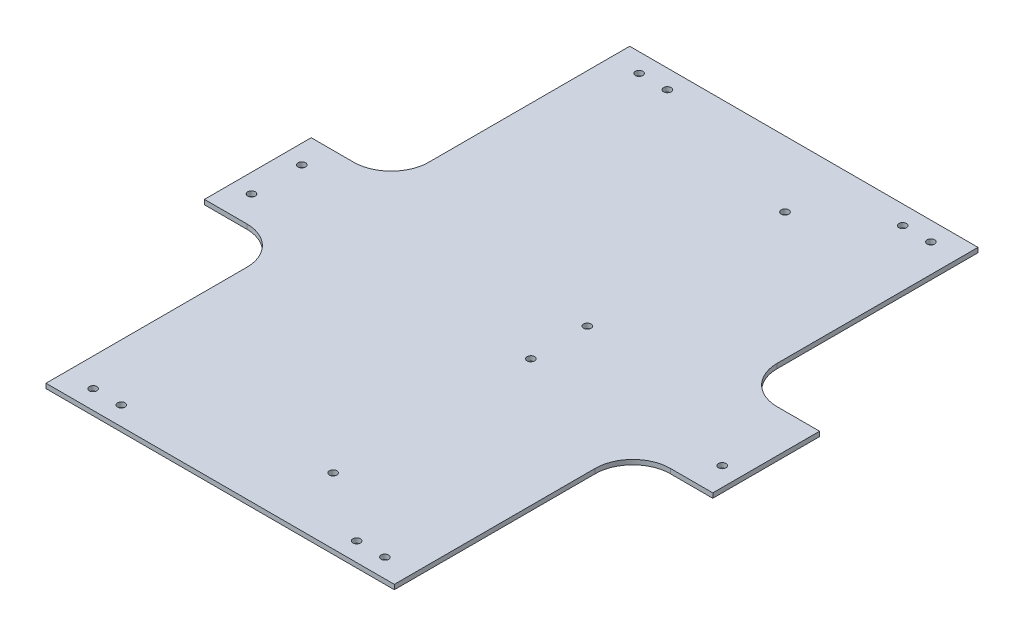
ISO-10303-21;
HEADER;
FILE_DESCRIPTION(('STEP AP214'),'2;1');
FILE_NAME('part.step','',(''),(''),'','','');
FILE_SCHEMA(('AUTOMOTIVE_DESIGN { 1 0 10303 214 1 1 1 1 }'));
ENDSEC;
DATA;
#1=APPLICATION_CONTEXT('core data for automotive mechanical design processes');
#2=APPLICATION_PROTOCOL_DEFINITION('international standard','automotive_design',2000,#1);
#3=PRODUCT_CONTEXT('',#1,'mechanical');
#4=PRODUCT('Part','Part','',(#3));
#5=PRODUCT_RELATED_PRODUCT_CATEGORY('part','',(#4));
#6=PRODUCT_DEFINITION_FORMATION('','',#4);
#7=PRODUCT_DEFINITION_CONTEXT('part definition',#1,'design');
#8=PRODUCT_DEFINITION('design','',#6,#7);
#9=PRODUCT_DEFINITION_SHAPE('','',#8);
#10=(LENGTH_UNIT() NAMED_UNIT(*) SI_UNIT(.MILLI.,.METRE.));
#11=(NAMED_UNIT(*) PLANE_ANGLE_UNIT() SI_UNIT($,.RADIAN.));
#12=(NAMED_UNIT(*) SI_UNIT($,.STERADIAN.) SOLID_ANGLE_UNIT());
#13=UNCERTAINTY_MEASURE_WITH_UNIT(LENGTH_MEASURE(1.E-05),#10,'distance_accuracy_value','');
#14=(GEOMETRIC_REPRESENTATION_CONTEXT(3) GLOBAL_UNCERTAINTY_ASSIGNED_CONTEXT((#13)) GLOBAL_UNIT_ASSIGNED_CONTEXT((#10,
#11,#12)) REPRESENTATION_CONTEXT('',''));
#15=CARTESIAN_POINT('',(0.,0.,0.));
#16=DIRECTION('',(0.,0.,1.));
#17=DIRECTION('',(1.,0.,0.));
#18=AXIS2_PLACEMENT_3D('',#15,#16,#17);
#19=CARTESIAN_POINT('',(0.,-107.700994014148,0.));
#20=DIRECTION('',(0.,-1.,0.));
#21=DIRECTION('',(0.,0.,-1.));
#22=AXIS2_PLACEMENT_3D('',#19,#20,#21);
#23=PLANE('',#22);
#24=DIRECTION('',(-1.,0.,0.));
#25=VECTOR('',#24,1.);
#26=CARTESIAN_POINT('',(271.436244825124,-107.700994014148,-21.4532223759465));
#27=LINE('',#26,#25);
#28=CARTESIAN_POINT('',(271.436244825124,-107.700994014148,-21.4532223759465));
#29=VERTEX_POINT('',#28);
#30=CARTESIAN_POINT('',(226.436244825124,-107.700994014148,-21.4532223759465));
#31=VERTEX_POINT('',#30);
#32=EDGE_CURVE('E252',#29,#31,#27,.T.);
#33=ORIENTED_EDGE('',*,*,#32,.T.);
#34=CARTESIAN_POINT('',(226.436244825124,-107.700994014148,-61.4532223759465));
#35=DIRECTION('',(0.,-1.,0.));
#36=DIRECTION('',(0.,0.,-1.));
#37=AXIS2_PLACEMENT_3D('',#34,#35,#36);
#38=CIRCLE('',#37,40.);
#39=CARTESIAN_POINT('',(186.436244825124,-107.700994014148,-61.4532223759465));
#40=VERTEX_POINT('',#39);
#41=EDGE_CURVE('E153',#31,#40,#38,.T.);
#42=ORIENTED_EDGE('',*,*,#41,.T.);
#43=DIRECTION('',(0.,0.,-1.));
#44=VECTOR('',#43,1.);
#45=CARTESIAN_POINT('',(186.436244825124,-107.700994014148,-274.737493623405));
#46=LINE('',#45,#44);
#47=CARTESIAN_POINT('',(186.436244825124,-107.700994014148,-274.737493623405));
#48=VERTEX_POINT('',#47);
#49=EDGE_CURVE('E145',#40,#48,#46,.T.);
#50=ORIENTED_EDGE('',*,*,#49,.T.);
#51=DIRECTION('',(-1.,0.,0.));
#52=VECTOR('',#51,1.);
#53=CARTESIAN_POINT('',(186.436244825124,-107.700994014148,-274.737493623405));
#54=LINE('',#53,#52);
#55=CARTESIAN_POINT('',(-183.563755174876,-107.700994014148,-274.737493623405));
#56=VERTEX_POINT('',#55);
#57=EDGE_CURVE('E150',#48,#56,#54,.T.);
#58=ORIENTED_EDGE('',*,*,#57,.T.);
#59=DIRECTION('',(0.,0.,1.));
#60=VECTOR('',#59,1.);
#61=CARTESIAN_POINT('',(-183.563755174876,-107.700994014148,-274.737493623405));
#62=LINE('',#61,#60);
#63=CARTESIAN_POINT('',(-183.563755174876,-107.700994014148,-61.4532223759464));
#64=VERTEX_POINT('',#63);
#65=EDGE_CURVE('E167',#56,#64,#62,.T.);
#66=ORIENTED_EDGE('',*,*,#65,.T.);
#67=CARTESIAN_POINT('',(-223.563755174876,-107.700994014148,-61.4532223759464));
#68=DIRECTION('',(0.,-1.,0.));
#69=DIRECTION('',(0.,0.,-1.));
#70=AXIS2_PLACEMENT_3D('',#67,#68,#69);
#71=CIRCLE('',#70,40.);
#72=CARTESIAN_POINT('',(-223.563755174876,-107.700994014148,-21.4532223759464));
#73=VERTEX_POINT('',#72);
#74=EDGE_CURVE('E198',#64,#73,#71,.T.);
#75=ORIENTED_EDGE('',*,*,#74,.T.);
#76=DIRECTION('',(-1.,0.,0.));
#77=VECTOR('',#76,1.);
#78=CARTESIAN_POINT('',(-183.563755174876,-107.700994014148,-21.4532223759464));
#79=LINE('',#78,#77);
#80=CARTESIAN_POINT('',(-268.563755174877,-107.700994014148,-21.4532223759464));
#81=VERTEX_POINT('',#80);
#82=EDGE_CURVE('E309',#73,#81,#79,.T.);
#83=ORIENTED_EDGE('',*,*,#82,.T.);
#84=DIRECTION('',(0.,0.,1.));
#85=VECTOR('',#84,1.);
#86=CARTESIAN_POINT('',(-268.563755174877,-107.700994014148,-21.4532223759464));
#87=LINE('',#86,#85);
#88=CARTESIAN_POINT('',(-268.563755174877,-107.700994014148,91.978235129135));
#89=VERTEX_POINT('',#88);
#90=EDGE_CURVE('E268',#81,#89,#87,.T.);
#91=ORIENTED_EDGE('',*,*,#90,.T.);
#92=DIRECTION('',(1.,0.,0.));
#93=VECTOR('',#92,1.);
#94=CARTESIAN_POINT('',(-183.563755174876,-107.700994014148,91.978235129135));
#95=LINE('',#94,#93);
#96=CARTESIAN_POINT('',(-223.563755174876,-107.700994014148,91.978235129135));
#97=VERTEX_POINT('',#96);
#98=EDGE_CURVE('E291',#89,#97,#95,.T.);
#99=ORIENTED_EDGE('',*,*,#98,.T.);
#100=CARTESIAN_POINT('',(-223.563755174876,-107.700994014148,131.978235129135));
#101=DIRECTION('',(0.,-1.,0.));
#102=DIRECTION('',(0.,0.,-1.));
#103=AXIS2_PLACEMENT_3D('',#100,#101,#102);
#104=CIRCLE('',#103,40.);
#105=CARTESIAN_POINT('',(-183.563755174876,-107.700994014148,131.978235129135));
#106=VERTEX_POINT('',#105);
#107=EDGE_CURVE('E11',#97,#106,#104,.T.);
#108=ORIENTED_EDGE('',*,*,#107,.T.);
#109=DIRECTION('',(0.,0.,1.));
#110=VECTOR('',#109,1.);
#111=CARTESIAN_POINT('',(-183.563755174876,-107.700994014148,91.978235129135));
#112=LINE('',#111,#110);
#113=CARTESIAN_POINT('',(-183.563755174876,-107.700994014148,345.262506376595));
#114=VERTEX_POINT('',#113);
#115=EDGE_CURVE('E288',#106,#114,#112,.T.);
#116=ORIENTED_EDGE('',*,*,#115,.T.);
#117=DIRECTION('',(1.,0.,0.));
#118=VECTOR('',#117,1.);
#119=CARTESIAN_POINT('',(186.436244825124,-107.700994014148,345.262506376595));
#120=LINE('',#119,#118);
#121=CARTESIAN_POINT('',(186.436244825124,-107.700994014148,345.262506376595));
#122=VERTEX_POINT('',#121);
#123=EDGE_CURVE('E287',#114,#122,#120,.T.);
#124=ORIENTED_EDGE('',*,*,#123,.T.);
#125=DIRECTION('',(0.,0.,-1.));
#126=VECTOR('',#125,1.);
#127=CARTESIAN_POINT('',(186.436244825124,-107.700994014148,91.978235129135));
#128=LINE('',#127,#126);
#129=CARTESIAN_POINT('',(186.436244825124,-107.700994014148,131.978235129135));
#130=VERTEX_POINT('',#129);
#131=EDGE_CURVE('E212',#122,#130,#128,.T.);
#132=ORIENTED_EDGE('',*,*,#131,.T.);
#133=CARTESIAN_POINT('',(226.436244825124,-107.700994014148,131.978235129135));
#134=DIRECTION('',(0.,-1.,0.));
#135=DIRECTION('',(0.,0.,-1.));
#136=AXIS2_PLACEMENT_3D('',#133,#134,#135);
#137=CIRCLE('',#136,40.);
#138=CARTESIAN_POINT('',(226.436244825124,-107.700994014148,91.978235129135));
#139=VERTEX_POINT('',#138);
#140=EDGE_CURVE('E205',#130,#139,#137,.T.);
#141=ORIENTED_EDGE('',*,*,#140,.T.);
#142=DIRECTION('',(1.,0.,0.));
#143=VECTOR('',#142,1.);
#144=CARTESIAN_POINT('',(271.436244825124,-107.700994014148,91.9782351291349));
#145=LINE('',#144,#143);
#146=CARTESIAN_POINT('',(271.436244825124,-107.700994014148,91.9782351291349));
#147=VERTEX_POINT('',#146);
#148=EDGE_CURVE('E209',#139,#147,#145,.T.);
#149=ORIENTED_EDGE('',*,*,#148,.T.);
#150=DIRECTION('',(0.,0.,-1.));
#151=VECTOR('',#150,1.);
#152=CARTESIAN_POINT('',(271.436244825124,-107.700994014148,-21.4532223759465));
#153=LINE('',#152,#151);
#154=EDGE_CURVE('E222',#147,#29,#153,.T.);
#155=ORIENTED_EDGE('',*,*,#154,.T.);
#156=EDGE_LOOP('',(#33,#42,#50,#58,#66,#75,#83,#91,#99,#108,#116,#124,#132,#141,#149,#155));
#157=FACE_BOUND('',#156,.T.);
#158=CARTESIAN_POINT('',(156.436244825124,-107.700994014148,325.262506376594));
#159=DIRECTION('',(0.,1.,0.));
#160=DIRECTION('',(0.,0.,1.));
#161=AXIS2_PLACEMENT_3D('',#158,#159,#160);
#162=CIRCLE('',#161,3.99999999999999);
#163=CARTESIAN_POINT('',(156.436244825124,-107.700994014148,329.262506376594));
#164=VERTEX_POINT('',#163);
#165=EDGE_CURVE('E299',#164,#164,#162,.T.);
#166=ORIENTED_EDGE('',*,*,#165,.F.);
#167=EDGE_LOOP('',(#166));
#168=FACE_BOUND('',#167,.T.);
#169=CARTESIAN_POINT('',(126.436244825124,-107.700994014148,325.262506376594));
#170=DIRECTION('',(0.,1.,0.));
#171=DIRECTION('',(0.,0.,1.));
#172=AXIS2_PLACEMENT_3D('',#169,#170,#171);
#173=CIRCLE('',#172,3.99999999999999);
#174=CARTESIAN_POINT('',(126.436244825124,-107.700994014148,329.262506376594));
#175=VERTEX_POINT('',#174);
#176=EDGE_CURVE('E626',#175,#175,#173,.T.);
#177=ORIENTED_EDGE('',*,*,#176,.F.);
#178=EDGE_LOOP('',(#177));
#179=FACE_BOUND('',#178,.T.);
#180=CARTESIAN_POINT('',(251.436244825124,-107.700994014148,61.9782351291349));
#181=DIRECTION('',(0.,1.,0.));
#182=DIRECTION('',(0.,0.,1.));
#183=AXIS2_PLACEMENT_3D('',#180,#181,#182);
#184=CIRCLE('',#183,3.99999999999999);
#185=CARTESIAN_POINT('',(251.436244825124,-107.700994014148,65.9782351291349));
#186=VERTEX_POINT('',#185);
#187=EDGE_CURVE('E634',#186,#186,#184,.T.);
#188=ORIENTED_EDGE('',*,*,#187,.F.);
#189=EDGE_LOOP('',(#188));
#190=FACE_BOUND('',#189,.T.);
#191=CARTESIAN_POINT('',(-153.563755174876,-107.700994014148,325.262506376594));
#192=DIRECTION('',(0.,1.,0.));
#193=DIRECTION('',(0.,0.,1.));
#194=AXIS2_PLACEMENT_3D('',#191,#192,#193);
#195=CIRCLE('',#194,3.99999999999999);
#196=CARTESIAN_POINT('',(-153.563755174876,-107.700994014148,329.262506376594));
#197=VERTEX_POINT('',#196);
#198=EDGE_CURVE('E639',#197,#197,#195,.T.);
#199=ORIENTED_EDGE('',*,*,#198,.F.);
#200=EDGE_LOOP('',(#199));
#201=FACE_BOUND('',#200,.T.);
#202=CARTESIAN_POINT('',(-123.563755174876,-107.700994014148,325.262506376595));
#203=DIRECTION('',(0.,1.,0.));
#204=DIRECTION('',(0.,0.,1.));
#205=AXIS2_PLACEMENT_3D('',#202,#203,#204);
#206=CIRCLE('',#205,4.00000000000001);
#207=CARTESIAN_POINT('',(-123.563755174876,-107.700994014148,329.262506376595));
#208=VERTEX_POINT('',#207);
#209=EDGE_CURVE('E645',#208,#208,#206,.T.);
#210=ORIENTED_EDGE('',*,*,#209,.F.);
#211=EDGE_LOOP('',(#210));
#212=FACE_BOUND('',#211,.T.);
#213=CARTESIAN_POINT('',(-248.563755174876,-107.700994014148,61.978235129135));
#214=DIRECTION('',(0.,1.,0.));
#215=DIRECTION('',(0.,0.,1.));
#216=AXIS2_PLACEMENT_3D('',#213,#214,#215);
#217=CIRCLE('',#216,3.99999999999999);
#218=CARTESIAN_POINT('',(-248.563755174876,-107.700994014148,65.978235129135));
#219=VERTEX_POINT('',#218);
#220=EDGE_CURVE('E651',#219,#219,#217,.T.);
#221=ORIENTED_EDGE('',*,*,#220,.F.);
#222=EDGE_LOOP('',(#221));
#223=FACE_BOUND('',#222,.T.);
#224=CARTESIAN_POINT('',(51.4362448251237,-107.700994014148,275.262506376595));
#225=DIRECTION('',(0.,1.,0.));
#226=DIRECTION('',(0.,0.,1.));
#227=AXIS2_PLACEMENT_3D('',#224,#225,#226);
#228=CIRCLE('',#227,4.00000000000001);
#229=CARTESIAN_POINT('',(51.4362448251237,-107.700994014148,279.262506376595));
#230=VERTEX_POINT('',#229);
#231=EDGE_CURVE('E657',#230,#230,#228,.T.);
#232=ORIENTED_EDGE('',*,*,#231,.F.);
#233=EDGE_LOOP('',(#232));
#234=FACE_BOUND('',#233,.T.);
#235=CARTESIAN_POINT('',(51.4362448251236,-107.700994014148,65.2625063765943));
#236=DIRECTION('',(0.,1.,0.));
#237=DIRECTION('',(0.,0.,1.));
#238=AXIS2_PLACEMENT_3D('',#235,#236,#237);
#239=CIRCLE('',#238,4.00000000000001);
#240=CARTESIAN_POINT('',(51.4362448251236,-107.700994014148,69.2625063765943));
#241=VERTEX_POINT('',#240);
#242=EDGE_CURVE('E663',#241,#241,#239,.T.);
#243=ORIENTED_EDGE('',*,*,#242,.F.);
#244=EDGE_LOOP('',(#243));
#245=FACE_BOUND('',#244,.T.);
#246=CARTESIAN_POINT('',(51.4362448251236,-107.700994014148,5.26250637659487));
#247=DIRECTION('',(0.,1.,0.));
#248=DIRECTION('',(0.,0.,-1.));
#249=AXIS2_PLACEMENT_3D('',#246,#247,#248);
#250=CIRCLE('',#249,4.00000000000001);
#251=CARTESIAN_POINT('',(51.4362448251236,-107.700994014148,1.26250637659487));
#252=VERTEX_POINT('',#251);
#253=EDGE_CURVE('E669',#252,#252,#250,.T.);
#254=ORIENTED_EDGE('',*,*,#253,.F.);
#255=EDGE_LOOP('',(#254));
#256=FACE_BOUND('',#255,.T.);
#257=CARTESIAN_POINT('',(51.4362448251237,-107.700994014148,-204.737493623405));
#258=DIRECTION('',(0.,1.,0.));
#259=DIRECTION('',(0.,0.,-1.));
#260=AXIS2_PLACEMENT_3D('',#257,#258,#259);
#261=CIRCLE('',#260,4.00000000000001);
#262=CARTESIAN_POINT('',(51.4362448251237,-107.700994014148,-208.737493623405));
#263=VERTEX_POINT('',#262);
#264=EDGE_CURVE('E675',#263,#263,#261,.T.);
#265=ORIENTED_EDGE('',*,*,#264,.F.);
#266=EDGE_LOOP('',(#265));
#267=FACE_BOUND('',#266,.T.);
#268=CARTESIAN_POINT('',(-248.563755174876,-107.700994014148,8.54677762405411));
#269=DIRECTION('',(0.,1.,0.));
#270=DIRECTION('',(0.,0.,-1.));
#271=AXIS2_PLACEMENT_3D('',#268,#269,#270);
#272=CIRCLE('',#271,3.99999999999999);
#273=CARTESIAN_POINT('',(-248.563755174876,-107.700994014148,4.54677762405412));
#274=VERTEX_POINT('',#273);
#275=EDGE_CURVE('E681',#274,#274,#272,.T.);
#276=ORIENTED_EDGE('',*,*,#275,.F.);
#277=EDGE_LOOP('',(#276));
#278=FACE_BOUND('',#277,.T.);
#279=CARTESIAN_POINT('',(-123.563755174876,-107.700994014148,-254.737493623405));
#280=DIRECTION('',(0.,1.,0.));
#281=DIRECTION('',(0.,0.,-1.));
#282=AXIS2_PLACEMENT_3D('',#279,#280,#281);
#283=CIRCLE('',#282,4.00000000000001);
#284=CARTESIAN_POINT('',(-123.563755174876,-107.700994014148,-258.737493623405));
#285=VERTEX_POINT('',#284);
#286=EDGE_CURVE('E687',#285,#285,#283,.T.);
#287=ORIENTED_EDGE('',*,*,#286,.F.);
#288=EDGE_LOOP('',(#287));
#289=FACE_BOUND('',#288,.T.);
#290=CARTESIAN_POINT('',(-153.563755174876,-107.700994014148,-254.737493623405));
#291=DIRECTION('',(0.,1.,0.));
#292=DIRECTION('',(0.,0.,-1.));
#293=AXIS2_PLACEMENT_3D('',#290,#291,#292);
#294=CIRCLE('',#293,3.99999999999999);
#295=CARTESIAN_POINT('',(-153.563755174876,-107.700994014148,-258.737493623405));
#296=VERTEX_POINT('',#295);
#297=EDGE_CURVE('E693',#296,#296,#294,.T.);
#298=ORIENTED_EDGE('',*,*,#297,.F.);
#299=EDGE_LOOP('',(#298));
#300=FACE_BOUND('',#299,.T.);
#301=CARTESIAN_POINT('',(126.436244825124,-107.700994014148,-254.737493623405));
#302=DIRECTION('',(0.,1.,0.));
#303=DIRECTION('',(0.,0.,-1.));
#304=AXIS2_PLACEMENT_3D('',#301,#302,#303);
#305=CIRCLE('',#304,3.99999999999999);
#306=CARTESIAN_POINT('',(126.436244825124,-107.700994014148,-258.737493623405));
#307=VERTEX_POINT('',#306);
#308=EDGE_CURVE('E699',#307,#307,#305,.T.);
#309=ORIENTED_EDGE('',*,*,#308,.F.);
#310=EDGE_LOOP('',(#309));
#311=FACE_BOUND('',#310,.T.);
#312=CARTESIAN_POINT('',(156.436244825124,-107.700994014148,-254.737493623405));
#313=DIRECTION('',(0.,1.,0.));
#314=DIRECTION('',(0.,0.,-1.));
#315=AXIS2_PLACEMENT_3D('',#312,#313,#314);
#316=CIRCLE('',#315,3.99999999999999);
#317=CARTESIAN_POINT('',(156.436244825124,-107.700994014148,-258.737493623405));
#318=VERTEX_POINT('',#317);
#319=EDGE_CURVE('E705',#318,#318,#316,.T.);
#320=ORIENTED_EDGE('',*,*,#319,.F.);
#321=EDGE_LOOP('',(#320));
#322=FACE_BOUND('',#321,.T.);
#323=ADVANCED_FACE('F33',(#157,#168,#179,#190,#201,#212,#223,#234,#245,#256,#267,#278,#289,#300,
#311,#322),#23,.F.);
#324=CARTESIAN_POINT('',(0.,-112.700994014148,0.));
#325=DIRECTION('',(0.,-1.,0.));
#326=DIRECTION('',(0.,0.,-1.));
#327=AXIS2_PLACEMENT_3D('',#324,#325,#326);
#328=PLANE('',#327);
#329=CARTESIAN_POINT('',(126.436244825124,-112.700994014148,-254.737493623405));
#330=DIRECTION('',(0.,1.,0.));
#331=DIRECTION('',(0.,0.,-1.));
#332=AXIS2_PLACEMENT_3D('',#329,#330,#331);
#333=CIRCLE('',#332,3.99999999999999);
#334=CARTESIAN_POINT('',(126.436244825124,-112.700994014148,-258.737493623405));
#335=VERTEX_POINT('',#334);
#336=EDGE_CURVE('E702',#335,#335,#333,.T.);
#337=ORIENTED_EDGE('',*,*,#336,.T.);
#338=EDGE_LOOP('',(#337));
#339=FACE_BOUND('',#338,.T.);
#340=CARTESIAN_POINT('',(-123.563755174876,-112.700994014148,-254.737493623405));
#341=DIRECTION('',(0.,1.,0.));
#342=DIRECTION('',(0.,0.,-1.));
#343=AXIS2_PLACEMENT_3D('',#340,#341,#342);
#344=CIRCLE('',#343,4.00000000000001);
#345=CARTESIAN_POINT('',(-123.563755174876,-112.700994014148,-258.737493623405));
#346=VERTEX_POINT('',#345);
#347=EDGE_CURVE('E690',#346,#346,#344,.T.);
#348=ORIENTED_EDGE('',*,*,#347,.T.);
#349=EDGE_LOOP('',(#348));
#350=FACE_BOUND('',#349,.T.);
#351=CARTESIAN_POINT('',(51.4362448251237,-112.700994014148,-204.737493623405));
#352=DIRECTION('',(0.,1.,0.));
#353=DIRECTION('',(0.,0.,-1.));
#354=AXIS2_PLACEMENT_3D('',#351,#352,#353);
#355=CIRCLE('',#354,4.00000000000001);
#356=CARTESIAN_POINT('',(51.4362448251237,-112.700994014148,-208.737493623405));
#357=VERTEX_POINT('',#356);
#358=EDGE_CURVE('E678',#357,#357,#355,.T.);
#359=ORIENTED_EDGE('',*,*,#358,.T.);
#360=EDGE_LOOP('',(#359));
#361=FACE_BOUND('',#360,.T.);
#362=CARTESIAN_POINT('',(51.4362448251236,-112.700994014148,65.2625063765943));
#363=DIRECTION('',(0.,1.,0.));
#364=DIRECTION('',(0.,0.,1.));
#365=AXIS2_PLACEMENT_3D('',#362,#363,#364);
#366=CIRCLE('',#365,4.00000000000001);
#367=CARTESIAN_POINT('',(51.4362448251236,-112.700994014148,69.2625063765943));
#368=VERTEX_POINT('',#367);
#369=EDGE_CURVE('E666',#368,#368,#366,.T.);
#370=ORIENTED_EDGE('',*,*,#369,.T.);
#371=EDGE_LOOP('',(#370));
#372=FACE_BOUND('',#371,.T.);
#373=CARTESIAN_POINT('',(-248.563755174876,-112.700994014148,61.978235129135));
#374=DIRECTION('',(0.,1.,0.));
#375=DIRECTION('',(0.,0.,1.));
#376=AXIS2_PLACEMENT_3D('',#373,#374,#375);
#377=CIRCLE('',#376,3.99999999999999);
#378=CARTESIAN_POINT('',(-248.563755174876,-112.700994014148,65.978235129135));
#379=VERTEX_POINT('',#378);
#380=EDGE_CURVE('E654',#379,#379,#377,.T.);
#381=ORIENTED_EDGE('',*,*,#380,.T.);
#382=EDGE_LOOP('',(#381));
#383=FACE_BOUND('',#382,.T.);
#384=CARTESIAN_POINT('',(-153.563755174876,-112.700994014148,325.262506376594));
#385=DIRECTION('',(0.,1.,0.));
#386=DIRECTION('',(0.,0.,1.));
#387=AXIS2_PLACEMENT_3D('',#384,#385,#386);
#388=CIRCLE('',#387,3.99999999999999);
#389=CARTESIAN_POINT('',(-153.563755174876,-112.700994014148,329.262506376594));
#390=VERTEX_POINT('',#389);
#391=EDGE_CURVE('E642',#390,#390,#388,.T.);
#392=ORIENTED_EDGE('',*,*,#391,.T.);
#393=EDGE_LOOP('',(#392));
#394=FACE_BOUND('',#393,.T.);
#395=CARTESIAN_POINT('',(126.436244825124,-112.700994014148,325.262506376594));
#396=DIRECTION('',(0.,1.,0.));
#397=DIRECTION('',(0.,0.,1.));
#398=AXIS2_PLACEMENT_3D('',#395,#396,#397);
#399=CIRCLE('',#398,3.99999999999999);
#400=CARTESIAN_POINT('',(126.436244825124,-112.700994014148,329.262506376594));
#401=VERTEX_POINT('',#400);
#402=EDGE_CURVE('E630',#401,#401,#399,.T.);
#403=ORIENTED_EDGE('',*,*,#402,.T.);
#404=EDGE_LOOP('',(#403));
#405=FACE_BOUND('',#404,.T.);
#406=DIRECTION('',(0.,0.,-1.));
#407=VECTOR('',#406,1.);
#408=CARTESIAN_POINT('',(186.436244825124,-112.700994014148,-274.737493623405));
#409=LINE('',#408,#407);
#410=CARTESIAN_POINT('',(186.436244825124,-112.700994014148,-61.4532223759465));
#411=VERTEX_POINT('',#410);
#412=CARTESIAN_POINT('',(186.436244825124,-112.700994014148,-274.737493623405));
#413=VERTEX_POINT('',#412);
#414=EDGE_CURVE('E171',#411,#413,#409,.T.);
#415=ORIENTED_EDGE('',*,*,#414,.F.);
#416=CARTESIAN_POINT('',(226.436244825124,-112.700994014148,-61.4532223759465));
#417=DIRECTION('',(0.,-1.,0.));
#418=DIRECTION('',(0.,0.,-1.));
#419=AXIS2_PLACEMENT_3D('',#416,#417,#418);
#420=CIRCLE('',#419,40.);
#421=CARTESIAN_POINT('',(226.436244825124,-112.700994014148,-21.4532223759465));
#422=VERTEX_POINT('',#421);
#423=EDGE_CURVE('E200',#411,#422,#420,.F.);
#424=ORIENTED_EDGE('',*,*,#423,.T.);
#425=DIRECTION('',(-1.,0.,0.));
#426=VECTOR('',#425,1.);
#427=CARTESIAN_POINT('',(271.436244825124,-112.700994014148,-21.4532223759465));
#428=LINE('',#427,#426);
#429=CARTESIAN_POINT('',(271.436244825124,-112.700994014148,-21.4532223759465));
#430=VERTEX_POINT('',#429);
#431=EDGE_CURVE('E158',#430,#422,#428,.T.);
#432=ORIENTED_EDGE('',*,*,#431,.F.);
#433=DIRECTION('',(0.,0.,-1.));
#434=VECTOR('',#433,1.);
#435=CARTESIAN_POINT('',(271.436244825124,-112.700994014148,-21.4532223759465));
#436=LINE('',#435,#434);
#437=CARTESIAN_POINT('',(271.436244825124,-112.700994014148,91.9782351291349));
#438=VERTEX_POINT('',#437);
#439=EDGE_CURVE('E240',#438,#430,#436,.T.);
#440=ORIENTED_EDGE('',*,*,#439,.F.);
#441=DIRECTION('',(1.,0.,0.));
#442=VECTOR('',#441,1.);
#443=CARTESIAN_POINT('',(271.436244825124,-112.700994014148,91.9782351291349));
#444=LINE('',#443,#442);
#445=CARTESIAN_POINT('',(226.436244825124,-112.700994014148,91.978235129135));
#446=VERTEX_POINT('',#445);
#447=EDGE_CURVE('E232',#446,#438,#444,.T.);
#448=ORIENTED_EDGE('',*,*,#447,.F.);
#449=CARTESIAN_POINT('',(226.436244825124,-112.700994014148,131.978235129135));
#450=DIRECTION('',(0.,-1.,0.));
#451=DIRECTION('',(0.,0.,-1.));
#452=AXIS2_PLACEMENT_3D('',#449,#450,#451);
#453=CIRCLE('',#452,40.);
#454=CARTESIAN_POINT('',(186.436244825124,-112.700994014148,131.978235129135));
#455=VERTEX_POINT('',#454);
#456=EDGE_CURVE('E203',#446,#455,#453,.F.);
#457=ORIENTED_EDGE('',*,*,#456,.T.);
#458=DIRECTION('',(0.,0.,-1.));
#459=VECTOR('',#458,1.);
#460=CARTESIAN_POINT('',(186.436244825124,-112.700994014148,91.978235129135));
#461=LINE('',#460,#459);
#462=CARTESIAN_POINT('',(186.436244825124,-112.700994014148,345.262506376595));
#463=VERTEX_POINT('',#462);
#464=EDGE_CURVE('E230',#463,#455,#461,.T.);
#465=ORIENTED_EDGE('',*,*,#464,.F.);
#466=DIRECTION('',(1.,0.,0.));
#467=VECTOR('',#466,1.);
#468=CARTESIAN_POINT('',(186.436244825124,-112.700994014148,345.262506376595));
#469=LINE('',#468,#467);
#470=CARTESIAN_POINT('',(-183.563755174876,-112.700994014148,345.262506376595));
#471=VERTEX_POINT('',#470);
#472=EDGE_CURVE('E238',#471,#463,#469,.T.);
#473=ORIENTED_EDGE('',*,*,#472,.F.);
#474=DIRECTION('',(0.,0.,1.));
#475=VECTOR('',#474,1.);
#476=CARTESIAN_POINT('',(-183.563755174876,-112.700994014148,91.978235129135));
#477=LINE('',#476,#475);
#478=CARTESIAN_POINT('',(-183.563755174876,-112.700994014148,131.978235129135));
#479=VERTEX_POINT('',#478);
#480=EDGE_CURVE('E242',#479,#471,#477,.T.);
#481=ORIENTED_EDGE('',*,*,#480,.F.);
#482=CARTESIAN_POINT('',(-223.563755174876,-112.700994014148,131.978235129135));
#483=DIRECTION('',(0.,-1.,0.));
#484=DIRECTION('',(0.,0.,-1.));
#485=AXIS2_PLACEMENT_3D('',#482,#483,#484);
#486=CIRCLE('',#485,40.);
#487=CARTESIAN_POINT('',(-223.563755174876,-112.700994014148,91.978235129135));
#488=VERTEX_POINT('',#487);
#489=EDGE_CURVE('E41',#479,#488,#486,.F.);
#490=ORIENTED_EDGE('',*,*,#489,.T.);
#491=DIRECTION('',(1.,0.,0.));
#492=VECTOR('',#491,1.);
#493=CARTESIAN_POINT('',(-183.563755174876,-112.700994014148,91.978235129135));
#494=LINE('',#493,#492);
#495=CARTESIAN_POINT('',(-268.563755174877,-112.700994014148,91.978235129135));
#496=VERTEX_POINT('',#495);
#497=EDGE_CURVE('E273',#496,#488,#494,.T.);
#498=ORIENTED_EDGE('',*,*,#497,.F.);
#499=DIRECTION('',(0.,0.,1.));
#500=VECTOR('',#499,1.);
#501=CARTESIAN_POINT('',(-268.563755174877,-112.700994014148,-21.4532223759464));
#502=LINE('',#501,#500);
#503=CARTESIAN_POINT('',(-268.563755174877,-112.700994014148,-21.4532223759464));
#504=VERTEX_POINT('',#503);
#505=EDGE_CURVE('E267',#504,#496,#502,.T.);
#506=ORIENTED_EDGE('',*,*,#505,.F.);
#507=DIRECTION('',(-1.,0.,0.));
#508=VECTOR('',#507,1.);
#509=CARTESIAN_POINT('',(-183.563755174876,-112.700994014148,-21.4532223759464));
#510=LINE('',#509,#508);
#511=CARTESIAN_POINT('',(-223.563755174876,-112.700994014148,-21.4532223759464));
#512=VERTEX_POINT('',#511);
#513=EDGE_CURVE('E272',#512,#504,#510,.T.);
#514=ORIENTED_EDGE('',*,*,#513,.F.);
#515=CARTESIAN_POINT('',(-223.563755174876,-112.700994014148,-61.4532223759464));
#516=DIRECTION('',(0.,-1.,0.));
#517=DIRECTION('',(0.,0.,-1.));
#518=AXIS2_PLACEMENT_3D('',#515,#516,#517);
#519=CIRCLE('',#518,40.);
#520=CARTESIAN_POINT('',(-183.563755174876,-112.700994014148,-61.4532223759464));
#521=VERTEX_POINT('',#520);
#522=EDGE_CURVE('E196',#512,#521,#519,.F.);
#523=ORIENTED_EDGE('',*,*,#522,.T.);
#524=DIRECTION('',(0.,0.,1.));
#525=VECTOR('',#524,1.);
#526=CARTESIAN_POINT('',(-183.563755174876,-112.700994014148,-274.737493623405));
#527=LINE('',#526,#525);
#528=CARTESIAN_POINT('',(-183.563755174876,-112.700994014148,-274.737493623405));
#529=VERTEX_POINT('',#528);
#530=EDGE_CURVE('E276',#529,#521,#527,.T.);
#531=ORIENTED_EDGE('',*,*,#530,.F.);
#532=DIRECTION('',(-1.,0.,0.));
#533=VECTOR('',#532,1.);
#534=CARTESIAN_POINT('',(186.436244825124,-112.700994014148,-274.737493623405));
#535=LINE('',#534,#533);
#536=EDGE_CURVE('E298',#413,#529,#535,.T.);
#537=ORIENTED_EDGE('',*,*,#536,.F.);
#538=EDGE_LOOP('',(#415,#424,#432,#440,#448,#457,#465,#473,#481,#490,#498,#506,#514,#523,#531,#537));
#539=FACE_BOUND('',#538,.T.);
#540=CARTESIAN_POINT('',(156.436244825124,-112.700994014148,325.262506376594));
#541=DIRECTION('',(0.,1.,0.));
#542=DIRECTION('',(0.,0.,1.));
#543=AXIS2_PLACEMENT_3D('',#540,#541,#542);
#544=CIRCLE('',#543,3.99999999999999);
#545=CARTESIAN_POINT('',(156.436244825124,-112.700994014148,329.262506376594));
#546=VERTEX_POINT('',#545);
#547=EDGE_CURVE('E625',#546,#546,#544,.T.);
#548=ORIENTED_EDGE('',*,*,#547,.T.);
#549=EDGE_LOOP('',(#548));
#550=FACE_BOUND('',#549,.T.);
#551=CARTESIAN_POINT('',(251.436244825124,-112.700994014148,61.9782351291349));
#552=DIRECTION('',(0.,1.,0.));
#553=DIRECTION('',(0.,0.,1.));
#554=AXIS2_PLACEMENT_3D('',#551,#552,#553);
#555=CIRCLE('',#554,3.99999999999999);
#556=CARTESIAN_POINT('',(251.436244825124,-112.700994014148,65.9782351291349));
#557=VERTEX_POINT('',#556);
#558=EDGE_CURVE('E636',#557,#557,#555,.T.);
#559=ORIENTED_EDGE('',*,*,#558,.T.);
#560=EDGE_LOOP('',(#559));
#561=FACE_BOUND('',#560,.T.);
#562=CARTESIAN_POINT('',(-123.563755174876,-112.700994014148,325.262506376595));
#563=DIRECTION('',(0.,1.,0.));
#564=DIRECTION('',(0.,0.,1.));
#565=AXIS2_PLACEMENT_3D('',#562,#563,#564);
#566=CIRCLE('',#565,4.00000000000001);
#567=CARTESIAN_POINT('',(-123.563755174876,-112.700994014148,329.262506376595));
#568=VERTEX_POINT('',#567);
#569=EDGE_CURVE('E648',#568,#568,#566,.T.);
#570=ORIENTED_EDGE('',*,*,#569,.T.);
#571=EDGE_LOOP('',(#570));
#572=FACE_BOUND('',#571,.T.);
#573=CARTESIAN_POINT('',(51.4362448251237,-112.700994014148,275.262506376595));
#574=DIRECTION('',(0.,1.,0.));
#575=DIRECTION('',(0.,0.,1.));
#576=AXIS2_PLACEMENT_3D('',#573,#574,#575);
#577=CIRCLE('',#576,4.00000000000001);
#578=CARTESIAN_POINT('',(51.4362448251237,-112.700994014148,279.262506376595));
#579=VERTEX_POINT('',#578);
#580=EDGE_CURVE('E660',#579,#579,#577,.T.);
#581=ORIENTED_EDGE('',*,*,#580,.T.);
#582=EDGE_LOOP('',(#581));
#583=FACE_BOUND('',#582,.T.);
#584=CARTESIAN_POINT('',(51.4362448251236,-112.700994014148,5.26250637659487));
#585=DIRECTION('',(0.,1.,0.));
#586=DIRECTION('',(0.,0.,-1.));
#587=AXIS2_PLACEMENT_3D('',#584,#585,#586);
#588=CIRCLE('',#587,4.00000000000001);
#589=CARTESIAN_POINT('',(51.4362448251236,-112.700994014148,1.26250637659487));
#590=VERTEX_POINT('',#589);
#591=EDGE_CURVE('E672',#590,#590,#588,.T.);
#592=ORIENTED_EDGE('',*,*,#591,.T.);
#593=EDGE_LOOP('',(#592));
#594=FACE_BOUND('',#593,.T.);
#595=CARTESIAN_POINT('',(-248.563755174876,-112.700994014148,8.54677762405411));
#596=DIRECTION('',(0.,1.,0.));
#597=DIRECTION('',(0.,0.,-1.));
#598=AXIS2_PLACEMENT_3D('',#595,#596,#597);
#599=CIRCLE('',#598,3.99999999999999);
#600=CARTESIAN_POINT('',(-248.563755174876,-112.700994014148,4.54677762405412));
#601=VERTEX_POINT('',#600);
#602=EDGE_CURVE('E684',#601,#601,#599,.T.);
#603=ORIENTED_EDGE('',*,*,#602,.T.);
#604=EDGE_LOOP('',(#603));
#605=FACE_BOUND('',#604,.T.);
#606=CARTESIAN_POINT('',(-153.563755174876,-112.700994014148,-254.737493623405));
#607=DIRECTION('',(0.,1.,0.));
#608=DIRECTION('',(0.,0.,-1.));
#609=AXIS2_PLACEMENT_3D('',#606,#607,#608);
#610=CIRCLE('',#609,3.99999999999999);
#611=CARTESIAN_POINT('',(-153.563755174876,-112.700994014148,-258.737493623405));
#612=VERTEX_POINT('',#611);
#613=EDGE_CURVE('E696',#612,#612,#610,.T.);
#614=ORIENTED_EDGE('',*,*,#613,.T.);
#615=EDGE_LOOP('',(#614));
#616=FACE_BOUND('',#615,.T.);
#617=CARTESIAN_POINT('',(156.436244825124,-112.700994014148,-254.737493623405));
#618=DIRECTION('',(0.,1.,0.));
#619=DIRECTION('',(0.,0.,-1.));
#620=AXIS2_PLACEMENT_3D('',#617,#618,#619);
#621=CIRCLE('',#620,3.99999999999999);
#622=CARTESIAN_POINT('',(156.436244825124,-112.700994014148,-258.737493623405));
#623=VERTEX_POINT('',#622);
#624=EDGE_CURVE('E708',#623,#623,#621,.T.);
#625=ORIENTED_EDGE('',*,*,#624,.T.);
#626=EDGE_LOOP('',(#625));
#627=FACE_BOUND('',#626,.T.);
#628=ADVANCED_FACE('F227',(#339,#350,#361,#372,#383,#394,#405,#539,#550,#561,#572,#583,#594,
#605,#616,#627),#328,.T.);
#629=CARTESIAN_POINT('',(186.436244825124,-107.700994014148,-274.737493623405));
#630=DIRECTION('',(-1.,0.,0.));
#631=DIRECTION('',(0.,0.,1.));
#632=AXIS2_PLACEMENT_3D('',#629,#630,#631);
#633=PLANE('',#632);
#634=ORIENTED_EDGE('',*,*,#49,.F.);
#635=DIRECTION('',(0.,-1.,0.));
#636=VECTOR('',#635,1.);
#637=CARTESIAN_POINT('',(186.436244825124,-112.700994014148,-61.4532223759465));
#638=LINE('',#637,#636);
#639=EDGE_CURVE('E183',#40,#411,#638,.T.);
#640=ORIENTED_EDGE('',*,*,#639,.T.);
#641=ORIENTED_EDGE('',*,*,#414,.T.);
#642=DIRECTION('',(0.,-1.,0.));
#643=VECTOR('',#642,1.);
#644=CARTESIAN_POINT('',(186.436244825124,-107.700994014148,-274.737493623405));
#645=LINE('',#644,#643);
#646=EDGE_CURVE('E163',#48,#413,#645,.T.);
#647=ORIENTED_EDGE('',*,*,#646,.F.);
#648=EDGE_LOOP('',(#634,#640,#641,#647));
#649=FACE_BOUND('',#648,.T.);
#650=ADVANCED_FACE('F169',(#649),#633,.F.);
#651=CARTESIAN_POINT('',(186.436244825124,-107.700994014148,-274.737493623405));
#652=DIRECTION('',(0.,0.,1.));
#653=DIRECTION('',(0.,-1.,0.));
#654=AXIS2_PLACEMENT_3D('',#651,#652,#653);
#655=PLANE('',#654);
#656=ORIENTED_EDGE('',*,*,#536,.T.);
#657=DIRECTION('',(0.,-1.,0.));
#658=VECTOR('',#657,1.);
#659=CARTESIAN_POINT('',(-183.563755174876,-107.700994014148,-274.737493623405));
#660=LINE('',#659,#658);
#661=EDGE_CURVE('E165',#56,#529,#660,.T.);
#662=ORIENTED_EDGE('',*,*,#661,.F.);
#663=ORIENTED_EDGE('',*,*,#57,.F.);
#664=ORIENTED_EDGE('',*,*,#646,.T.);
#665=EDGE_LOOP('',(#656,#662,#663,#664));
#666=FACE_BOUND('',#665,.T.);
#667=ADVANCED_FACE('F162',(#666),#655,.F.);
#668=CARTESIAN_POINT('',(-183.563755174876,-107.700994014148,-274.737493623405));
#669=DIRECTION('',(1.,0.,0.));
#670=DIRECTION('',(0.,0.,-1.));
#671=AXIS2_PLACEMENT_3D('',#668,#669,#670);
#672=PLANE('',#671);
#673=ORIENTED_EDGE('',*,*,#530,.T.);
#674=DIRECTION('',(0.,-1.,0.));
#675=VECTOR('',#674,1.);
#676=CARTESIAN_POINT('',(-183.563755174876,-107.700994014148,-61.4532223759464));
#677=LINE('',#676,#675);
#678=EDGE_CURVE('E176',#521,#64,#677,.F.);
#679=ORIENTED_EDGE('',*,*,#678,.T.);
#680=ORIENTED_EDGE('',*,*,#65,.F.);
#681=ORIENTED_EDGE('',*,*,#661,.T.);
#682=EDGE_LOOP('',(#673,#679,#680,#681));
#683=FACE_BOUND('',#682,.T.);
#684=ADVANCED_FACE('F304',(#683),#672,.F.);
#685=CARTESIAN_POINT('',(-183.563755174876,-107.700994014148,-21.4532223759464));
#686=DIRECTION('',(0.,0.,1.));
#687=DIRECTION('',(1.,0.,0.));
#688=AXIS2_PLACEMENT_3D('',#685,#686,#687);
#689=PLANE('',#688);
#690=ORIENTED_EDGE('',*,*,#82,.F.);
#691=DIRECTION('',(0.,-1.,0.));
#692=VECTOR('',#691,1.);
#693=CARTESIAN_POINT('',(-223.563755174876,-112.700994014148,-21.4532223759464));
#694=LINE('',#693,#692);
#695=EDGE_CURVE('E173',#73,#512,#694,.T.);
#696=ORIENTED_EDGE('',*,*,#695,.T.);
#697=ORIENTED_EDGE('',*,*,#513,.T.);
#698=DIRECTION('',(0.,-1.,0.));
#699=VECTOR('',#698,1.);
#700=CARTESIAN_POINT('',(-268.563755174877,-107.700994014148,-21.4532223759464));
#701=LINE('',#700,#699);
#702=EDGE_CURVE('E178',#81,#504,#701,.T.);
#703=ORIENTED_EDGE('',*,*,#702,.F.);
#704=EDGE_LOOP('',(#690,#696,#697,#703));
#705=FACE_BOUND('',#704,.T.);
#706=ADVANCED_FACE('F310',(#705),#689,.F.);
#707=CARTESIAN_POINT('',(-268.563755174877,-107.700994014148,-21.4532223759464));
#708=DIRECTION('',(1.,0.,0.));
#709=DIRECTION('',(0.,0.,-1.));
#710=AXIS2_PLACEMENT_3D('',#707,#708,#709);
#711=PLANE('',#710);
#712=ORIENTED_EDGE('',*,*,#505,.T.);
#713=DIRECTION('',(0.,-1.,0.));
#714=VECTOR('',#713,1.);
#715=CARTESIAN_POINT('',(-268.563755174877,-107.700994014148,91.978235129135));
#716=LINE('',#715,#714);
#717=EDGE_CURVE('E258',#89,#496,#716,.T.);
#718=ORIENTED_EDGE('',*,*,#717,.F.);
#719=ORIENTED_EDGE('',*,*,#90,.F.);
#720=ORIENTED_EDGE('',*,*,#702,.T.);
#721=EDGE_LOOP('',(#712,#718,#719,#720));
#722=FACE_BOUND('',#721,.T.);
#723=ADVANCED_FACE('F265',(#722),#711,.F.);
#724=CARTESIAN_POINT('',(-183.563755174876,-107.700994014148,91.978235129135));
#725=DIRECTION('',(0.,0.,-1.));
#726=DIRECTION('',(-1.,0.,0.));
#727=AXIS2_PLACEMENT_3D('',#724,#725,#726);
#728=PLANE('',#727);
#729=ORIENTED_EDGE('',*,*,#497,.T.);
#730=DIRECTION('',(0.,-1.,0.));
#731=VECTOR('',#730,1.);
#732=CARTESIAN_POINT('',(-223.563755174876,-107.700994014148,91.978235129135));
#733=LINE('',#732,#731);
#734=EDGE_CURVE('E48',#488,#97,#733,.F.);
#735=ORIENTED_EDGE('',*,*,#734,.T.);
#736=ORIENTED_EDGE('',*,*,#98,.F.);
#737=ORIENTED_EDGE('',*,*,#717,.T.);
#738=EDGE_LOOP('',(#729,#735,#736,#737));
#739=FACE_BOUND('',#738,.T.);
#740=ADVANCED_FACE('F348',(#739),#728,.F.);
#741=CARTESIAN_POINT('',(-183.563755174876,-107.700994014148,91.978235129135));
#742=DIRECTION('',(1.,0.,0.));
#743=DIRECTION('',(0.,0.,-1.));
#744=AXIS2_PLACEMENT_3D('',#741,#742,#743);
#745=PLANE('',#744);
#746=ORIENTED_EDGE('',*,*,#115,.F.);
#747=DIRECTION('',(0.,-1.,0.));
#748=VECTOR('',#747,1.);
#749=CARTESIAN_POINT('',(-183.563755174876,-112.700994014148,131.978235129135));
#750=LINE('',#749,#748);
#751=EDGE_CURVE('E192',#106,#479,#750,.T.);
#752=ORIENTED_EDGE('',*,*,#751,.T.);
#753=ORIENTED_EDGE('',*,*,#480,.T.);
#754=DIRECTION('',(0.,-1.,0.));
#755=VECTOR('',#754,1.);
#756=CARTESIAN_POINT('',(-183.563755174876,-107.700994014148,345.262506376595));
#757=LINE('',#756,#755);
#758=EDGE_CURVE('E255',#114,#471,#757,.T.);
#759=ORIENTED_EDGE('',*,*,#758,.F.);
#760=EDGE_LOOP('',(#746,#752,#753,#759));
#761=FACE_BOUND('',#760,.T.);
#762=ADVANCED_FACE('F282',(#761),#745,.F.);
#763=CARTESIAN_POINT('',(186.436244825124,-107.700994014148,345.262506376595));
#764=DIRECTION('',(0.,0.,-1.));
#765=DIRECTION('',(0.,1.,0.));
#766=AXIS2_PLACEMENT_3D('',#763,#764,#765);
#767=PLANE('',#766);
#768=ORIENTED_EDGE('',*,*,#472,.T.);
#769=DIRECTION('',(0.,-1.,0.));
#770=VECTOR('',#769,1.);
#771=CARTESIAN_POINT('',(186.436244825124,-107.700994014148,345.262506376595));
#772=LINE('',#771,#770);
#773=EDGE_CURVE('E237',#122,#463,#772,.T.);
#774=ORIENTED_EDGE('',*,*,#773,.F.);
#775=ORIENTED_EDGE('',*,*,#123,.F.);
#776=ORIENTED_EDGE('',*,*,#758,.T.);
#777=EDGE_LOOP('',(#768,#774,#775,#776));
#778=FACE_BOUND('',#777,.T.);
#779=ADVANCED_FACE('F286',(#778),#767,.F.);
#780=CARTESIAN_POINT('',(186.436244825124,-107.700994014148,91.978235129135));
#781=DIRECTION('',(-1.,0.,0.));
#782=DIRECTION('',(0.,0.,1.));
#783=AXIS2_PLACEMENT_3D('',#780,#781,#782);
#784=PLANE('',#783);
#785=ORIENTED_EDGE('',*,*,#464,.T.);
#786=DIRECTION('',(0.,-1.,0.));
#787=VECTOR('',#786,1.);
#788=CARTESIAN_POINT('',(186.436244825124,-107.700994014148,131.978235129135));
#789=LINE('',#788,#787);
#790=EDGE_CURVE('E190',#455,#130,#789,.F.);
#791=ORIENTED_EDGE('',*,*,#790,.T.);
#792=ORIENTED_EDGE('',*,*,#131,.F.);
#793=ORIENTED_EDGE('',*,*,#773,.T.);
#794=EDGE_LOOP('',(#785,#791,#792,#793));
#795=FACE_BOUND('',#794,.T.);
#796=ADVANCED_FACE('F235',(#795),#784,.F.);
#797=CARTESIAN_POINT('',(271.436244825124,-107.700994014148,91.9782351291349));
#798=DIRECTION('',(0.,0.,-1.));
#799=DIRECTION('',(-1.,0.,0.));
#800=AXIS2_PLACEMENT_3D('',#797,#798,#799);
#801=PLANE('',#800);
#802=ORIENTED_EDGE('',*,*,#148,.F.);
#803=DIRECTION('',(0.,-1.,0.));
#804=VECTOR('',#803,1.);
#805=CARTESIAN_POINT('',(226.436244825124,-112.700994014148,91.9782351291349));
#806=LINE('',#805,#804);
#807=EDGE_CURVE('E187',#139,#446,#806,.T.);
#808=ORIENTED_EDGE('',*,*,#807,.T.);
#809=ORIENTED_EDGE('',*,*,#447,.T.);
#810=DIRECTION('',(0.,-1.,0.));
#811=VECTOR('',#810,1.);
#812=CARTESIAN_POINT('',(271.436244825124,-107.700994014148,91.9782351291349));
#813=LINE('',#812,#811);
#814=EDGE_CURVE('E220',#147,#438,#813,.T.);
#815=ORIENTED_EDGE('',*,*,#814,.F.);
#816=EDGE_LOOP('',(#802,#808,#809,#815));
#817=FACE_BOUND('',#816,.T.);
#818=ADVANCED_FACE('F217',(#817),#801,.F.);
#819=CARTESIAN_POINT('',(271.436244825124,-107.700994014148,-21.4532223759465));
#820=DIRECTION('',(-1.,0.,0.));
#821=DIRECTION('',(0.,0.,1.));
#822=AXIS2_PLACEMENT_3D('',#819,#820,#821);
#823=PLANE('',#822);
#824=ORIENTED_EDGE('',*,*,#439,.T.);
#825=DIRECTION('',(0.,-1.,0.));
#826=VECTOR('',#825,1.);
#827=CARTESIAN_POINT('',(271.436244825124,-107.700994014148,-21.4532223759465));
#828=LINE('',#827,#826);
#829=EDGE_CURVE('E249',#29,#430,#828,.T.);
#830=ORIENTED_EDGE('',*,*,#829,.F.);
#831=ORIENTED_EDGE('',*,*,#154,.F.);
#832=ORIENTED_EDGE('',*,*,#814,.T.);
#833=EDGE_LOOP('',(#824,#830,#831,#832));
#834=FACE_BOUND('',#833,.T.);
#835=ADVANCED_FACE('F335',(#834),#823,.F.);
#836=CARTESIAN_POINT('',(271.436244825124,-107.700994014148,-21.4532223759465));
#837=DIRECTION('',(0.,0.,1.));
#838=DIRECTION('',(1.,0.,0.));
#839=AXIS2_PLACEMENT_3D('',#836,#837,#838);
#840=PLANE('',#839);
#841=ORIENTED_EDGE('',*,*,#431,.T.);
#842=DIRECTION('',(0.,-1.,0.));
#843=VECTOR('',#842,1.);
#844=CARTESIAN_POINT('',(226.436244825124,-107.700994014148,-21.4532223759465));
#845=LINE('',#844,#843);
#846=EDGE_CURVE('E185',#422,#31,#845,.F.);
#847=ORIENTED_EDGE('',*,*,#846,.T.);
#848=ORIENTED_EDGE('',*,*,#32,.F.);
#849=ORIENTED_EDGE('',*,*,#829,.T.);
#850=EDGE_LOOP('',(#841,#847,#848,#849));
#851=FACE_BOUND('',#850,.T.);
#852=ADVANCED_FACE('F332',(#851),#840,.F.);
#853=CARTESIAN_POINT('',(156.436244825124,-107.700994014148,325.262506376594));
#854=DIRECTION('',(0.,-1.,0.));
#855=DIRECTION('',(0.,0.,-1.));
#856=AXIS2_PLACEMENT_3D('',#853,#854,#855);
#857=CYLINDRICAL_SURFACE('',#856,3.99999999999999);
#858=ORIENTED_EDGE('',*,*,#165,.T.);
#859=EDGE_LOOP('',(#858));
#860=FACE_BOUND('',#859,.T.);
#861=ORIENTED_EDGE('',*,*,#547,.F.);
#862=EDGE_LOOP('',(#861));
#863=FACE_BOUND('',#862,.T.);
#864=ADVANCED_FACE('F329',(#860,#863),#857,.F.);
#865=CARTESIAN_POINT('',(126.436244825124,-107.700994014148,325.262506376594));
#866=DIRECTION('',(0.,-1.,0.));
#867=DIRECTION('',(0.,0.,-1.));
#868=AXIS2_PLACEMENT_3D('',#865,#866,#867);
#869=CYLINDRICAL_SURFACE('',#868,3.99999999999999);
#870=ORIENTED_EDGE('',*,*,#176,.T.);
#871=EDGE_LOOP('',(#870));
#872=FACE_BOUND('',#871,.T.);
#873=ORIENTED_EDGE('',*,*,#402,.F.);
#874=EDGE_LOOP('',(#873));
#875=FACE_BOUND('',#874,.T.);
#876=ADVANCED_FACE('F507',(#872,#875),#869,.F.);
#877=CARTESIAN_POINT('',(251.436244825124,-107.700994014148,61.9782351291349));
#878=DIRECTION('',(0.,-1.,0.));
#879=DIRECTION('',(0.,0.,-1.));
#880=AXIS2_PLACEMENT_3D('',#877,#878,#879);
#881=CYLINDRICAL_SURFACE('',#880,3.99999999999999);
#882=ORIENTED_EDGE('',*,*,#187,.T.);
#883=EDGE_LOOP('',(#882));
#884=FACE_BOUND('',#883,.T.);
#885=ORIENTED_EDGE('',*,*,#558,.F.);
#886=EDGE_LOOP('',(#885));
#887=FACE_BOUND('',#886,.T.);
#888=ADVANCED_FACE('F498',(#884,#887),#881,.F.);
#889=CARTESIAN_POINT('',(-153.563755174876,-107.700994014148,325.262506376594));
#890=DIRECTION('',(0.,-1.,0.));
#891=DIRECTION('',(0.,0.,-1.));
#892=AXIS2_PLACEMENT_3D('',#889,#890,#891);
#893=CYLINDRICAL_SURFACE('',#892,3.99999999999999);
#894=ORIENTED_EDGE('',*,*,#198,.T.);
#895=EDGE_LOOP('',(#894));
#896=FACE_BOUND('',#895,.T.);
#897=ORIENTED_EDGE('',*,*,#391,.F.);
#898=EDGE_LOOP('',(#897));
#899=FACE_BOUND('',#898,.T.);
#900=ADVANCED_FACE('F489',(#896,#899),#893,.F.);
#901=CARTESIAN_POINT('',(-123.563755174876,-107.700994014148,325.262506376595));
#902=DIRECTION('',(0.,-1.,0.));
#903=DIRECTION('',(0.,0.,-1.));
#904=AXIS2_PLACEMENT_3D('',#901,#902,#903);
#905=CYLINDRICAL_SURFACE('',#904,4.00000000000001);
#906=ORIENTED_EDGE('',*,*,#209,.T.);
#907=EDGE_LOOP('',(#906));
#908=FACE_BOUND('',#907,.T.);
#909=ORIENTED_EDGE('',*,*,#569,.F.);
#910=EDGE_LOOP('',(#909));
#911=FACE_BOUND('',#910,.T.);
#912=ADVANCED_FACE('F480',(#908,#911),#905,.F.);
#913=CARTESIAN_POINT('',(-248.563755174876,-107.700994014148,61.978235129135));
#914=DIRECTION('',(0.,-1.,0.));
#915=DIRECTION('',(0.,0.,-1.));
#916=AXIS2_PLACEMENT_3D('',#913,#914,#915);
#917=CYLINDRICAL_SURFACE('',#916,3.99999999999999);
#918=ORIENTED_EDGE('',*,*,#220,.T.);
#919=EDGE_LOOP('',(#918));
#920=FACE_BOUND('',#919,.T.);
#921=ORIENTED_EDGE('',*,*,#380,.F.);
#922=EDGE_LOOP('',(#921));
#923=FACE_BOUND('',#922,.T.);
#924=ADVANCED_FACE('F471',(#920,#923),#917,.F.);
#925=CARTESIAN_POINT('',(51.4362448251237,-107.700994014148,275.262506376595));
#926=DIRECTION('',(0.,-1.,0.));
#927=DIRECTION('',(0.,0.,-1.));
#928=AXIS2_PLACEMENT_3D('',#925,#926,#927);
#929=CYLINDRICAL_SURFACE('',#928,4.00000000000001);
#930=ORIENTED_EDGE('',*,*,#231,.T.);
#931=EDGE_LOOP('',(#930));
#932=FACE_BOUND('',#931,.T.);
#933=ORIENTED_EDGE('',*,*,#580,.F.);
#934=EDGE_LOOP('',(#933));
#935=FACE_BOUND('',#934,.T.);
#936=ADVANCED_FACE('F462',(#932,#935),#929,.F.);
#937=CARTESIAN_POINT('',(51.4362448251236,-107.700994014148,65.2625063765943));
#938=DIRECTION('',(0.,-1.,0.));
#939=DIRECTION('',(0.,0.,-1.));
#940=AXIS2_PLACEMENT_3D('',#937,#938,#939);
#941=CYLINDRICAL_SURFACE('',#940,4.00000000000001);
#942=ORIENTED_EDGE('',*,*,#242,.T.);
#943=EDGE_LOOP('',(#942));
#944=FACE_BOUND('',#943,.T.);
#945=ORIENTED_EDGE('',*,*,#369,.F.);
#946=EDGE_LOOP('',(#945));
#947=FACE_BOUND('',#946,.T.);
#948=ADVANCED_FACE('F453',(#944,#947),#941,.F.);
#949=CARTESIAN_POINT('',(51.4362448251236,-107.700994014148,5.26250637659487));
#950=DIRECTION('',(0.,-1.,0.));
#951=DIRECTION('',(0.,0.,-1.));
#952=AXIS2_PLACEMENT_3D('',#949,#950,#951);
#953=CYLINDRICAL_SURFACE('',#952,4.00000000000001);
#954=ORIENTED_EDGE('',*,*,#253,.T.);
#955=EDGE_LOOP('',(#954));
#956=FACE_BOUND('',#955,.T.);
#957=ORIENTED_EDGE('',*,*,#591,.F.);
#958=EDGE_LOOP('',(#957));
#959=FACE_BOUND('',#958,.T.);
#960=ADVANCED_FACE('F444',(#956,#959),#953,.F.);
#961=CARTESIAN_POINT('',(51.4362448251237,-107.700994014148,-204.737493623405));
#962=DIRECTION('',(0.,-1.,0.));
#963=DIRECTION('',(0.,0.,-1.));
#964=AXIS2_PLACEMENT_3D('',#961,#962,#963);
#965=CYLINDRICAL_SURFACE('',#964,4.00000000000001);
#966=ORIENTED_EDGE('',*,*,#264,.T.);
#967=EDGE_LOOP('',(#966));
#968=FACE_BOUND('',#967,.T.);
#969=ORIENTED_EDGE('',*,*,#358,.F.);
#970=EDGE_LOOP('',(#969));
#971=FACE_BOUND('',#970,.T.);
#972=ADVANCED_FACE('F435',(#968,#971),#965,.F.);
#973=CARTESIAN_POINT('',(-248.563755174876,-107.700994014148,8.54677762405411));
#974=DIRECTION('',(0.,-1.,0.));
#975=DIRECTION('',(0.,0.,-1.));
#976=AXIS2_PLACEMENT_3D('',#973,#974,#975);
#977=CYLINDRICAL_SURFACE('',#976,3.99999999999999);
#978=ORIENTED_EDGE('',*,*,#275,.T.);
#979=EDGE_LOOP('',(#978));
#980=FACE_BOUND('',#979,.T.);
#981=ORIENTED_EDGE('',*,*,#602,.F.);
#982=EDGE_LOOP('',(#981));
#983=FACE_BOUND('',#982,.T.);
#984=ADVANCED_FACE('F426',(#980,#983),#977,.F.);
#985=CARTESIAN_POINT('',(-123.563755174876,-107.700994014148,-254.737493623405));
#986=DIRECTION('',(0.,-1.,0.));
#987=DIRECTION('',(0.,0.,-1.));
#988=AXIS2_PLACEMENT_3D('',#985,#986,#987);
#989=CYLINDRICAL_SURFACE('',#988,4.00000000000001);
#990=ORIENTED_EDGE('',*,*,#286,.T.);
#991=EDGE_LOOP('',(#990));
#992=FACE_BOUND('',#991,.T.);
#993=ORIENTED_EDGE('',*,*,#347,.F.);
#994=EDGE_LOOP('',(#993));
#995=FACE_BOUND('',#994,.T.);
#996=ADVANCED_FACE('F417',(#992,#995),#989,.F.);
#997=CARTESIAN_POINT('',(-153.563755174876,-107.700994014148,-254.737493623405));
#998=DIRECTION('',(0.,-1.,0.));
#999=DIRECTION('',(0.,0.,-1.));
#1000=AXIS2_PLACEMENT_3D('',#997,#998,#999);
#1001=CYLINDRICAL_SURFACE('',#1000,3.99999999999999);
#1002=ORIENTED_EDGE('',*,*,#297,.T.);
#1003=EDGE_LOOP('',(#1002));
#1004=FACE_BOUND('',#1003,.T.);
#1005=ORIENTED_EDGE('',*,*,#613,.F.);
#1006=EDGE_LOOP('',(#1005));
#1007=FACE_BOUND('',#1006,.T.);
#1008=ADVANCED_FACE('F408',(#1004,#1007),#1001,.F.);
#1009=CARTESIAN_POINT('',(126.436244825124,-107.700994014148,-254.737493623405));
#1010=DIRECTION('',(0.,-1.,0.));
#1011=DIRECTION('',(0.,0.,-1.));
#1012=AXIS2_PLACEMENT_3D('',#1009,#1010,#1011);
#1013=CYLINDRICAL_SURFACE('',#1012,3.99999999999999);
#1014=ORIENTED_EDGE('',*,*,#308,.T.);
#1015=EDGE_LOOP('',(#1014));
#1016=FACE_BOUND('',#1015,.T.);
#1017=ORIENTED_EDGE('',*,*,#336,.F.);
#1018=EDGE_LOOP('',(#1017));
#1019=FACE_BOUND('',#1018,.T.);
#1020=ADVANCED_FACE('F399',(#1016,#1019),#1013,.F.);
#1021=CARTESIAN_POINT('',(156.436244825124,-107.700994014148,-254.737493623405));
#1022=DIRECTION('',(0.,-1.,0.));
#1023=DIRECTION('',(0.,0.,-1.));
#1024=AXIS2_PLACEMENT_3D('',#1021,#1022,#1023);
#1025=CYLINDRICAL_SURFACE('',#1024,3.99999999999999);
#1026=ORIENTED_EDGE('',*,*,#319,.T.);
#1027=EDGE_LOOP('',(#1026));
#1028=FACE_BOUND('',#1027,.T.);
#1029=ORIENTED_EDGE('',*,*,#624,.F.);
#1030=EDGE_LOOP('',(#1029));
#1031=FACE_BOUND('',#1030,.T.);
#1032=ADVANCED_FACE('F363',(#1028,#1031),#1025,.F.);
#1033=CARTESIAN_POINT('',(-223.563755174876,-107.700994014148,-61.4532223759464));
#1034=DIRECTION('',(0.,1.,0.));
#1035=DIRECTION('',(0.,0.,1.));
#1036=AXIS2_PLACEMENT_3D('',#1033,#1034,#1035);
#1037=CYLINDRICAL_SURFACE('',#1036,40.);
#1038=ORIENTED_EDGE('',*,*,#74,.F.);
#1039=ORIENTED_EDGE('',*,*,#678,.F.);
#1040=ORIENTED_EDGE('',*,*,#522,.F.);
#1041=ORIENTED_EDGE('',*,*,#695,.F.);
#1042=EDGE_LOOP('',(#1038,#1039,#1040,#1041));
#1043=FACE_BOUND('',#1042,.T.);
#1044=ADVANCED_FACE('F307',(#1043),#1037,.F.);
#1045=CARTESIAN_POINT('',(226.436244825124,-107.700994014148,-61.4532223759465));
#1046=DIRECTION('',(0.,1.,0.));
#1047=DIRECTION('',(0.,0.,1.));
#1048=AXIS2_PLACEMENT_3D('',#1045,#1046,#1047);
#1049=CYLINDRICAL_SURFACE('',#1048,40.);
#1050=ORIENTED_EDGE('',*,*,#41,.F.);
#1051=ORIENTED_EDGE('',*,*,#846,.F.);
#1052=ORIENTED_EDGE('',*,*,#423,.F.);
#1053=ORIENTED_EDGE('',*,*,#639,.F.);
#1054=EDGE_LOOP('',(#1050,#1051,#1052,#1053));
#1055=FACE_BOUND('',#1054,.T.);
#1056=ADVANCED_FACE('F320',(#1055),#1049,.F.);
#1057=CARTESIAN_POINT('',(226.436244825124,-107.700994014148,131.978235129135));
#1058=DIRECTION('',(0.,1.,0.));
#1059=DIRECTION('',(0.,0.,1.));
#1060=AXIS2_PLACEMENT_3D('',#1057,#1058,#1059);
#1061=CYLINDRICAL_SURFACE('',#1060,40.);
#1062=ORIENTED_EDGE('',*,*,#140,.F.);
#1063=ORIENTED_EDGE('',*,*,#790,.F.);
#1064=ORIENTED_EDGE('',*,*,#456,.F.);
#1065=ORIENTED_EDGE('',*,*,#807,.F.);
#1066=EDGE_LOOP('',(#1062,#1063,#1064,#1065));
#1067=FACE_BOUND('',#1066,.T.);
#1068=ADVANCED_FACE('F224',(#1067),#1061,.F.);
#1069=CARTESIAN_POINT('',(-223.563755174876,-107.700994014148,131.978235129135));
#1070=DIRECTION('',(0.,1.,0.));
#1071=DIRECTION('',(0.,0.,1.));
#1072=AXIS2_PLACEMENT_3D('',#1069,#1070,#1071);
#1073=CYLINDRICAL_SURFACE('',#1072,40.);
#1074=ORIENTED_EDGE('',*,*,#107,.F.);
#1075=ORIENTED_EDGE('',*,*,#734,.F.);
#1076=ORIENTED_EDGE('',*,*,#489,.F.);
#1077=ORIENTED_EDGE('',*,*,#751,.F.);
#1078=EDGE_LOOP('',(#1074,#1075,#1076,#1077));
#1079=FACE_BOUND('',#1078,.T.);
#1080=ADVANCED_FACE('F35',(#1079),#1073,.F.);
#1081=CLOSED_SHELL('',(#323,#628,#650,#667,#684,#706,#723,#740,#762,#779,#796,#818,#835,#852,
#864,#876,#888,#900,#912,#924,#936,#948,#960,#972,#984,#996,#1008,#1020,#1032,#1044,#1056,#1068,#1080));
#1082=MANIFOLD_SOLID_BREP('B2',#1081);
#1083=ADVANCED_BREP_SHAPE_REPRESENTATION('',(#18,#1082),#14);
#1084=SHAPE_DEFINITION_REPRESENTATION(#9,#1083);
ENDSEC;
END-ISO-10303-21;
